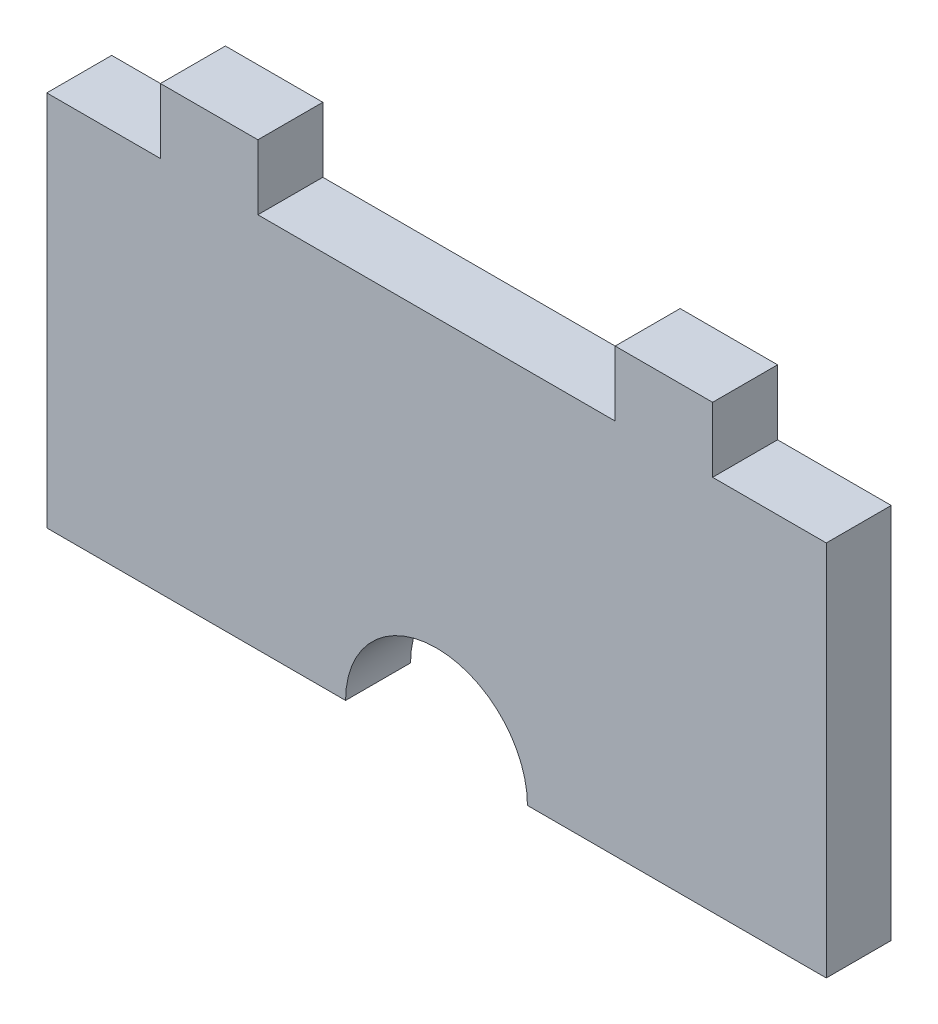
ISO-10303-21;
HEADER;
FILE_DESCRIPTION(('STEP AP214'),'2;1');
FILE_NAME('part.step','',(''),(''),'','','');
FILE_SCHEMA(('AUTOMOTIVE_DESIGN { 1 0 10303 214 1 1 1 1 }'));
ENDSEC;
DATA;
#1=APPLICATION_CONTEXT('core data for automotive mechanical design processes');
#2=APPLICATION_PROTOCOL_DEFINITION('international standard','automotive_design',2000,#1);
#3=PRODUCT_CONTEXT('',#1,'mechanical');
#4=PRODUCT('Part','Part','',(#3));
#5=PRODUCT_RELATED_PRODUCT_CATEGORY('part','',(#4));
#6=PRODUCT_DEFINITION_FORMATION('','',#4);
#7=PRODUCT_DEFINITION_CONTEXT('part definition',#1,'design');
#8=PRODUCT_DEFINITION('design','',#6,#7);
#9=PRODUCT_DEFINITION_SHAPE('','',#8);
#10=(LENGTH_UNIT() NAMED_UNIT(*) SI_UNIT(.MILLI.,.METRE.));
#11=(NAMED_UNIT(*) PLANE_ANGLE_UNIT() SI_UNIT($,.RADIAN.));
#12=(NAMED_UNIT(*) SI_UNIT($,.STERADIAN.) SOLID_ANGLE_UNIT());
#13=UNCERTAINTY_MEASURE_WITH_UNIT(LENGTH_MEASURE(1.E-05),#10,'distance_accuracy_value','');
#14=(GEOMETRIC_REPRESENTATION_CONTEXT(3) GLOBAL_UNCERTAINTY_ASSIGNED_CONTEXT((#13)) GLOBAL_UNIT_ASSIGNED_CONTEXT((#10,
#11,#12)) REPRESENTATION_CONTEXT('',''));
#15=CARTESIAN_POINT('',(0.,0.,0.));
#16=DIRECTION('',(0.,0.,1.));
#17=DIRECTION('',(1.,0.,0.));
#18=AXIS2_PLACEMENT_3D('',#15,#16,#17);
#19=CARTESIAN_POINT('',(-76.2,142.24,-12.7));
#20=DIRECTION('',(0.,-1.,0.));
#21=DIRECTION('',(0.,0.,-1.));
#22=AXIS2_PLACEMENT_3D('',#19,#20,#21);
#23=PLANE('',#22);
#24=DIRECTION('',(0.,0.,1.));
#25=VECTOR('',#24,1.);
#26=CARTESIAN_POINT('',(17.78,142.24,-12.7));
#27=LINE('',#26,#25);
#28=CARTESIAN_POINT('',(17.78,142.24,-12.7));
#29=VERTEX_POINT('',#28);
#30=CARTESIAN_POINT('',(17.78,142.24,0.));
#31=VERTEX_POINT('',#30);
#32=EDGE_CURVE('E48',#29,#31,#27,.T.);
#33=ORIENTED_EDGE('',*,*,#32,.F.);
#34=DIRECTION('',(1.,0.,0.));
#35=VECTOR('',#34,1.);
#36=CARTESIAN_POINT('',(-76.2,142.24,-12.7));
#37=LINE('',#36,#35);
#38=CARTESIAN_POINT('',(76.2,142.24,-12.7));
#39=VERTEX_POINT('',#38);
#40=EDGE_CURVE('E391',#29,#39,#37,.T.);
#41=ORIENTED_EDGE('',*,*,#40,.T.);
#42=DIRECTION('',(0.,0.,1.));
#43=VECTOR('',#42,1.);
#44=CARTESIAN_POINT('',(76.2,142.24,-12.7));
#45=LINE('',#44,#43);
#46=CARTESIAN_POINT('',(76.2,142.24,0.));
#47=VERTEX_POINT('',#46);
#48=EDGE_CURVE('E214',#39,#47,#45,.T.);
#49=ORIENTED_EDGE('',*,*,#48,.T.);
#50=DIRECTION('',(1.,0.,0.));
#51=VECTOR('',#50,1.);
#52=CARTESIAN_POINT('',(-76.2,142.24,0.));
#53=LINE('',#52,#51);
#54=EDGE_CURVE('E169',#31,#47,#53,.T.);
#55=ORIENTED_EDGE('',*,*,#54,.F.);
#56=EDGE_LOOP('',(#33,#41,#49,#55));
#57=FACE_BOUND('',#56,.T.);
#58=ADVANCED_FACE('F31',(#57),#23,.T.);
#59=CARTESIAN_POINT('',(-76.2,215.9,-12.7));
#60=DIRECTION('',(-1.,0.,0.));
#61=DIRECTION('',(0.,-1.,0.));
#62=AXIS2_PLACEMENT_3D('',#59,#60,#61);
#63=PLANE('',#62);
#64=DIRECTION('',(0.,-1.,0.));
#65=VECTOR('',#64,1.);
#66=CARTESIAN_POINT('',(-76.2,215.9,0.));
#67=LINE('',#66,#65);
#68=CARTESIAN_POINT('',(-76.2,215.9,0.));
#69=VERTEX_POINT('',#68);
#70=CARTESIAN_POINT('',(-76.2,142.24,0.));
#71=VERTEX_POINT('',#70);
#72=EDGE_CURVE('E166',#69,#71,#67,.T.);
#73=ORIENTED_EDGE('',*,*,#72,.F.);
#74=DIRECTION('',(0.,0.,1.));
#75=VECTOR('',#74,1.);
#76=CARTESIAN_POINT('',(-76.2,215.9,-12.7));
#77=LINE('',#76,#75);
#78=CARTESIAN_POINT('',(-76.2,215.9,-12.7));
#79=VERTEX_POINT('',#78);
#80=EDGE_CURVE('E11',#79,#69,#77,.T.);
#81=ORIENTED_EDGE('',*,*,#80,.F.);
#82=DIRECTION('',(0.,-1.,0.));
#83=VECTOR('',#82,1.);
#84=CARTESIAN_POINT('',(-76.2,215.9,-12.7));
#85=LINE('',#84,#83);
#86=CARTESIAN_POINT('',(-76.2,142.24,-12.7));
#87=VERTEX_POINT('',#86);
#88=EDGE_CURVE('E199',#79,#87,#85,.T.);
#89=ORIENTED_EDGE('',*,*,#88,.T.);
#90=DIRECTION('',(0.,0.,1.));
#91=VECTOR('',#90,1.);
#92=CARTESIAN_POINT('',(-76.2,142.24,-12.7));
#93=LINE('',#92,#91);
#94=EDGE_CURVE('E35',#87,#71,#93,.T.);
#95=ORIENTED_EDGE('',*,*,#94,.T.);
#96=EDGE_LOOP('',(#73,#81,#89,#95));
#97=FACE_BOUND('',#96,.T.);
#98=ADVANCED_FACE('F33',(#97),#63,.T.);
#99=CARTESIAN_POINT('',(-76.2,215.9,-12.7));
#100=DIRECTION('',(0.,1.,0.));
#101=DIRECTION('',(0.,0.,1.));
#102=AXIS2_PLACEMENT_3D('',#99,#100,#101);
#103=PLANE('',#102);
#104=DIRECTION('',(-1.,0.,0.));
#105=VECTOR('',#104,1.);
#106=CARTESIAN_POINT('',(-76.2,215.9,0.));
#107=LINE('',#106,#105);
#108=CARTESIAN_POINT('',(-53.975,215.9,0.));
#109=VERTEX_POINT('',#108);
#110=EDGE_CURVE('E197',#109,#69,#107,.T.);
#111=ORIENTED_EDGE('',*,*,#110,.F.);
#112=DIRECTION('',(0.,0.,1.));
#113=VECTOR('',#112,1.);
#114=CARTESIAN_POINT('',(-53.975,215.9,-12.7));
#115=LINE('',#114,#113);
#116=CARTESIAN_POINT('',(-53.975,215.9,-12.7));
#117=VERTEX_POINT('',#116);
#118=EDGE_CURVE('E40',#117,#109,#115,.T.);
#119=ORIENTED_EDGE('',*,*,#118,.F.);
#120=DIRECTION('',(-1.,0.,0.));
#121=VECTOR('',#120,1.);
#122=CARTESIAN_POINT('',(-76.2,215.9,-12.7));
#123=LINE('',#122,#121);
#124=EDGE_CURVE('E156',#117,#79,#123,.T.);
#125=ORIENTED_EDGE('',*,*,#124,.T.);
#126=ORIENTED_EDGE('',*,*,#80,.T.);
#127=EDGE_LOOP('',(#111,#119,#125,#126));
#128=FACE_BOUND('',#127,.T.);
#129=ADVANCED_FACE('F226',(#128),#103,.T.);
#130=CARTESIAN_POINT('',(-53.975,215.9,-12.7));
#131=DIRECTION('',(-1.,0.,0.));
#132=DIRECTION('',(0.,0.,1.));
#133=AXIS2_PLACEMENT_3D('',#130,#131,#132);
#134=PLANE('',#133);
#135=DIRECTION('',(0.,-1.,0.));
#136=VECTOR('',#135,1.);
#137=CARTESIAN_POINT('',(-53.975,215.9,0.));
#138=LINE('',#137,#136);
#139=CARTESIAN_POINT('',(-53.975,228.6,0.));
#140=VERTEX_POINT('',#139);
#141=EDGE_CURVE('E142',#140,#109,#138,.T.);
#142=ORIENTED_EDGE('',*,*,#141,.F.);
#143=DIRECTION('',(0.,0.,1.));
#144=VECTOR('',#143,1.);
#145=CARTESIAN_POINT('',(-53.975,228.6,-12.7));
#146=LINE('',#145,#144);
#147=CARTESIAN_POINT('',(-53.975,228.6,-12.7));
#148=VERTEX_POINT('',#147);
#149=EDGE_CURVE('E136',#148,#140,#146,.T.);
#150=ORIENTED_EDGE('',*,*,#149,.F.);
#151=DIRECTION('',(0.,-1.,0.));
#152=VECTOR('',#151,1.);
#153=CARTESIAN_POINT('',(-53.975,215.9,-12.7));
#154=LINE('',#153,#152);
#155=EDGE_CURVE('E139',#148,#117,#154,.T.);
#156=ORIENTED_EDGE('',*,*,#155,.T.);
#157=ORIENTED_EDGE('',*,*,#118,.T.);
#158=EDGE_LOOP('',(#142,#150,#156,#157));
#159=FACE_BOUND('',#158,.T.);
#160=ADVANCED_FACE('F138',(#159),#134,.T.);
#161=CARTESIAN_POINT('',(-34.925,228.6,-12.7));
#162=DIRECTION('',(0.,1.,0.));
#163=DIRECTION('',(0.,0.,1.));
#164=AXIS2_PLACEMENT_3D('',#161,#162,#163);
#165=PLANE('',#164);
#166=DIRECTION('',(-1.,0.,0.));
#167=VECTOR('',#166,1.);
#168=CARTESIAN_POINT('',(-34.925,228.6,0.));
#169=LINE('',#168,#167);
#170=CARTESIAN_POINT('',(-34.925,228.6,0.));
#171=VERTEX_POINT('',#170);
#172=EDGE_CURVE('E194',#171,#140,#169,.T.);
#173=ORIENTED_EDGE('',*,*,#172,.F.);
#174=DIRECTION('',(0.,0.,1.));
#175=VECTOR('',#174,1.);
#176=CARTESIAN_POINT('',(-34.925,228.6,-12.7));
#177=LINE('',#176,#175);
#178=CARTESIAN_POINT('',(-34.925,228.6,-12.7));
#179=VERTEX_POINT('',#178);
#180=EDGE_CURVE('E147',#179,#171,#177,.T.);
#181=ORIENTED_EDGE('',*,*,#180,.F.);
#182=DIRECTION('',(-1.,0.,0.));
#183=VECTOR('',#182,1.);
#184=CARTESIAN_POINT('',(-34.925,228.6,-12.7));
#185=LINE('',#184,#183);
#186=EDGE_CURVE('E154',#179,#148,#185,.T.);
#187=ORIENTED_EDGE('',*,*,#186,.T.);
#188=ORIENTED_EDGE('',*,*,#149,.T.);
#189=EDGE_LOOP('',(#173,#181,#187,#188));
#190=FACE_BOUND('',#189,.T.);
#191=ADVANCED_FACE('F158',(#190),#165,.T.);
#192=CARTESIAN_POINT('',(-34.925,215.9,-12.7));
#193=DIRECTION('',(1.,0.,0.));
#194=DIRECTION('',(0.,0.,-1.));
#195=AXIS2_PLACEMENT_3D('',#192,#193,#194);
#196=PLANE('',#195);
#197=DIRECTION('',(0.,1.,0.));
#198=VECTOR('',#197,1.);
#199=CARTESIAN_POINT('',(-34.925,215.9,0.));
#200=LINE('',#199,#198);
#201=CARTESIAN_POINT('',(-34.925,215.9,0.));
#202=VERTEX_POINT('',#201);
#203=EDGE_CURVE('E191',#202,#171,#200,.T.);
#204=ORIENTED_EDGE('',*,*,#203,.F.);
#205=DIRECTION('',(0.,0.,1.));
#206=VECTOR('',#205,1.);
#207=CARTESIAN_POINT('',(-34.925,215.9,-12.7));
#208=LINE('',#207,#206);
#209=CARTESIAN_POINT('',(-34.925,215.9,-12.7));
#210=VERTEX_POINT('',#209);
#211=EDGE_CURVE('E203',#210,#202,#208,.T.);
#212=ORIENTED_EDGE('',*,*,#211,.F.);
#213=DIRECTION('',(0.,1.,0.));
#214=VECTOR('',#213,1.);
#215=CARTESIAN_POINT('',(-34.925,215.9,-12.7));
#216=LINE('',#215,#214);
#217=EDGE_CURVE('E159',#210,#179,#216,.T.);
#218=ORIENTED_EDGE('',*,*,#217,.T.);
#219=ORIENTED_EDGE('',*,*,#180,.T.);
#220=EDGE_LOOP('',(#204,#212,#218,#219));
#221=FACE_BOUND('',#220,.T.);
#222=ADVANCED_FACE('F269',(#221),#196,.T.);
#223=CARTESIAN_POINT('',(-34.925,215.9,-12.7));
#224=DIRECTION('',(0.,1.,0.));
#225=DIRECTION('',(0.,0.,1.));
#226=AXIS2_PLACEMENT_3D('',#223,#224,#225);
#227=PLANE('',#226);
#228=DIRECTION('',(-1.,0.,0.));
#229=VECTOR('',#228,1.);
#230=CARTESIAN_POINT('',(-34.925,215.9,0.));
#231=LINE('',#230,#229);
#232=CARTESIAN_POINT('',(34.925,215.9,0.));
#233=VERTEX_POINT('',#232);
#234=EDGE_CURVE('E188',#233,#202,#231,.T.);
#235=ORIENTED_EDGE('',*,*,#234,.F.);
#236=DIRECTION('',(0.,0.,1.));
#237=VECTOR('',#236,1.);
#238=CARTESIAN_POINT('',(34.925,215.9,-12.7));
#239=LINE('',#238,#237);
#240=CARTESIAN_POINT('',(34.925,215.9,-12.7));
#241=VERTEX_POINT('',#240);
#242=EDGE_CURVE('E205',#241,#233,#239,.T.);
#243=ORIENTED_EDGE('',*,*,#242,.F.);
#244=DIRECTION('',(-1.,0.,0.));
#245=VECTOR('',#244,1.);
#246=CARTESIAN_POINT('',(-34.925,215.9,-12.7));
#247=LINE('',#246,#245);
#248=EDGE_CURVE('E161',#241,#210,#247,.T.);
#249=ORIENTED_EDGE('',*,*,#248,.T.);
#250=ORIENTED_EDGE('',*,*,#211,.T.);
#251=EDGE_LOOP('',(#235,#243,#249,#250));
#252=FACE_BOUND('',#251,.T.);
#253=ADVANCED_FACE('F265',(#252),#227,.T.);
#254=CARTESIAN_POINT('',(34.925,215.9,-12.7));
#255=DIRECTION('',(-1.,0.,0.));
#256=DIRECTION('',(0.,0.,1.));
#257=AXIS2_PLACEMENT_3D('',#254,#255,#256);
#258=PLANE('',#257);
#259=DIRECTION('',(0.,-1.,0.));
#260=VECTOR('',#259,1.);
#261=CARTESIAN_POINT('',(34.925,215.9,0.));
#262=LINE('',#261,#260);
#263=CARTESIAN_POINT('',(34.925,228.6,0.));
#264=VERTEX_POINT('',#263);
#265=EDGE_CURVE('E185',#264,#233,#262,.T.);
#266=ORIENTED_EDGE('',*,*,#265,.F.);
#267=DIRECTION('',(0.,0.,1.));
#268=VECTOR('',#267,1.);
#269=CARTESIAN_POINT('',(34.925,228.6,-12.7));
#270=LINE('',#269,#268);
#271=CARTESIAN_POINT('',(34.925,228.6,-12.7));
#272=VERTEX_POINT('',#271);
#273=EDGE_CURVE('E207',#272,#264,#270,.T.);
#274=ORIENTED_EDGE('',*,*,#273,.F.);
#275=DIRECTION('',(0.,-1.,0.));
#276=VECTOR('',#275,1.);
#277=CARTESIAN_POINT('',(34.925,215.9,-12.7));
#278=LINE('',#277,#276);
#279=EDGE_CURVE('E374',#272,#241,#278,.T.);
#280=ORIENTED_EDGE('',*,*,#279,.T.);
#281=ORIENTED_EDGE('',*,*,#242,.T.);
#282=EDGE_LOOP('',(#266,#274,#280,#281));
#283=FACE_BOUND('',#282,.T.);
#284=ADVANCED_FACE('F261',(#283),#258,.T.);
#285=CARTESIAN_POINT('',(53.975,228.6,-12.7));
#286=DIRECTION('',(0.,1.,0.));
#287=DIRECTION('',(0.,0.,1.));
#288=AXIS2_PLACEMENT_3D('',#285,#286,#287);
#289=PLANE('',#288);
#290=DIRECTION('',(-1.,0.,0.));
#291=VECTOR('',#290,1.);
#292=CARTESIAN_POINT('',(53.975,228.6,0.));
#293=LINE('',#292,#291);
#294=CARTESIAN_POINT('',(53.975,228.6,0.));
#295=VERTEX_POINT('',#294);
#296=EDGE_CURVE('E182',#295,#264,#293,.T.);
#297=ORIENTED_EDGE('',*,*,#296,.F.);
#298=DIRECTION('',(0.,0.,1.));
#299=VECTOR('',#298,1.);
#300=CARTESIAN_POINT('',(53.975,228.6,-12.7));
#301=LINE('',#300,#299);
#302=CARTESIAN_POINT('',(53.975,228.6,-12.7));
#303=VERTEX_POINT('',#302);
#304=EDGE_CURVE('E209',#303,#295,#301,.T.);
#305=ORIENTED_EDGE('',*,*,#304,.F.);
#306=DIRECTION('',(-1.,0.,0.));
#307=VECTOR('',#306,1.);
#308=CARTESIAN_POINT('',(53.975,228.6,-12.7));
#309=LINE('',#308,#307);
#310=EDGE_CURVE('E375',#303,#272,#309,.T.);
#311=ORIENTED_EDGE('',*,*,#310,.T.);
#312=ORIENTED_EDGE('',*,*,#273,.T.);
#313=EDGE_LOOP('',(#297,#305,#311,#312));
#314=FACE_BOUND('',#313,.T.);
#315=ADVANCED_FACE('F257',(#314),#289,.T.);
#316=CARTESIAN_POINT('',(53.975,215.9,-12.7));
#317=DIRECTION('',(1.,0.,0.));
#318=DIRECTION('',(0.,0.,-1.));
#319=AXIS2_PLACEMENT_3D('',#316,#317,#318);
#320=PLANE('',#319);
#321=DIRECTION('',(0.,1.,0.));
#322=VECTOR('',#321,1.);
#323=CARTESIAN_POINT('',(53.975,215.9,0.));
#324=LINE('',#323,#322);
#325=CARTESIAN_POINT('',(53.975,215.9,0.));
#326=VERTEX_POINT('',#325);
#327=EDGE_CURVE('E179',#326,#295,#324,.T.);
#328=ORIENTED_EDGE('',*,*,#327,.F.);
#329=DIRECTION('',(0.,0.,1.));
#330=VECTOR('',#329,1.);
#331=CARTESIAN_POINT('',(53.975,215.9,-12.7));
#332=LINE('',#331,#330);
#333=CARTESIAN_POINT('',(53.975,215.9,-12.7));
#334=VERTEX_POINT('',#333);
#335=EDGE_CURVE('E211',#334,#326,#332,.T.);
#336=ORIENTED_EDGE('',*,*,#335,.F.);
#337=DIRECTION('',(0.,1.,0.));
#338=VECTOR('',#337,1.);
#339=CARTESIAN_POINT('',(53.975,215.9,-12.7));
#340=LINE('',#339,#338);
#341=EDGE_CURVE('E380',#334,#303,#340,.T.);
#342=ORIENTED_EDGE('',*,*,#341,.T.);
#343=ORIENTED_EDGE('',*,*,#304,.T.);
#344=EDGE_LOOP('',(#328,#336,#342,#343));
#345=FACE_BOUND('',#344,.T.);
#346=ADVANCED_FACE('F251',(#345),#320,.T.);
#347=CARTESIAN_POINT('',(53.975,215.9,-12.7));
#348=DIRECTION('',(0.,1.,0.));
#349=DIRECTION('',(0.,0.,1.));
#350=AXIS2_PLACEMENT_3D('',#347,#348,#349);
#351=PLANE('',#350);
#352=DIRECTION('',(-1.,0.,0.));
#353=VECTOR('',#352,1.);
#354=CARTESIAN_POINT('',(53.975,215.9,0.));
#355=LINE('',#354,#353);
#356=CARTESIAN_POINT('',(76.2,215.9,0.));
#357=VERTEX_POINT('',#356);
#358=EDGE_CURVE('E176',#357,#326,#355,.T.);
#359=ORIENTED_EDGE('',*,*,#358,.F.);
#360=DIRECTION('',(0.,0.,1.));
#361=VECTOR('',#360,1.);
#362=CARTESIAN_POINT('',(76.2,215.9,-12.7));
#363=LINE('',#362,#361);
#364=CARTESIAN_POINT('',(76.2,215.9,-12.7));
#365=VERTEX_POINT('',#364);
#366=EDGE_CURVE('E213',#365,#357,#363,.T.);
#367=ORIENTED_EDGE('',*,*,#366,.F.);
#368=DIRECTION('',(-1.,0.,0.));
#369=VECTOR('',#368,1.);
#370=CARTESIAN_POINT('',(53.975,215.9,-12.7));
#371=LINE('',#370,#369);
#372=EDGE_CURVE('E383',#365,#334,#371,.T.);
#373=ORIENTED_EDGE('',*,*,#372,.T.);
#374=ORIENTED_EDGE('',*,*,#335,.T.);
#375=EDGE_LOOP('',(#359,#367,#373,#374));
#376=FACE_BOUND('',#375,.T.);
#377=ADVANCED_FACE('F246',(#376),#351,.T.);
#378=CARTESIAN_POINT('',(76.2,215.9,-12.7));
#379=DIRECTION('',(1.,0.,0.));
#380=DIRECTION('',(0.,0.,-1.));
#381=AXIS2_PLACEMENT_3D('',#378,#379,#380);
#382=PLANE('',#381);
#383=DIRECTION('',(0.,1.,0.));
#384=VECTOR('',#383,1.);
#385=CARTESIAN_POINT('',(76.2,215.9,0.));
#386=LINE('',#385,#384);
#387=EDGE_CURVE('E173',#47,#357,#386,.T.);
#388=ORIENTED_EDGE('',*,*,#387,.F.);
#389=ORIENTED_EDGE('',*,*,#48,.F.);
#390=DIRECTION('',(0.,1.,0.));
#391=VECTOR('',#390,1.);
#392=CARTESIAN_POINT('',(76.2,215.9,-12.7));
#393=LINE('',#392,#391);
#394=EDGE_CURVE('E386',#39,#365,#393,.T.);
#395=ORIENTED_EDGE('',*,*,#394,.T.);
#396=ORIENTED_EDGE('',*,*,#366,.T.);
#397=EDGE_LOOP('',(#388,#389,#395,#396));
#398=FACE_BOUND('',#397,.T.);
#399=ADVANCED_FACE('F240',(#398),#382,.T.);
#400=DIRECTION('',(0.,0.,1.));
#401=VECTOR('',#400,1.);
#402=CARTESIAN_POINT('',(-17.78,142.24,-12.7));
#403=LINE('',#402,#401);
#404=CARTESIAN_POINT('',(-17.78,142.24,0.));
#405=VERTEX_POINT('',#404);
#406=CARTESIAN_POINT('',(-17.78,142.24,-12.7));
#407=VERTEX_POINT('',#406);
#408=EDGE_CURVE('E223',#405,#407,#403,.F.);
#409=ORIENTED_EDGE('',*,*,#408,.F.);
#410=EDGE_CURVE('E170',#71,#405,#53,.T.);
#411=ORIENTED_EDGE('',*,*,#410,.F.);
#412=ORIENTED_EDGE('',*,*,#94,.F.);
#413=EDGE_CURVE('E389',#87,#407,#37,.T.);
#414=ORIENTED_EDGE('',*,*,#413,.T.);
#415=EDGE_LOOP('',(#409,#411,#412,#414));
#416=FACE_BOUND('',#415,.T.);
#417=ADVANCED_FACE('F221',(#416),#23,.T.);
#418=CARTESIAN_POINT('',(-76.2,142.24,-12.7));
#419=DIRECTION('',(0.,0.,1.));
#420=DIRECTION('',(1.,0.,0.));
#421=AXIS2_PLACEMENT_3D('',#418,#419,#420);
#422=PLANE('',#421);
#423=ORIENTED_EDGE('',*,*,#40,.F.);
#424=CARTESIAN_POINT('',(0.,142.24,-12.7));
#425=DIRECTION('',(0.,0.,1.));
#426=DIRECTION('',(1.,0.,0.));
#427=AXIS2_PLACEMENT_3D('',#424,#425,#426);
#428=CIRCLE('',#427,17.78);
#429=EDGE_CURVE('E395',#29,#407,#428,.T.);
#430=ORIENTED_EDGE('',*,*,#429,.T.);
#431=ORIENTED_EDGE('',*,*,#413,.F.);
#432=ORIENTED_EDGE('',*,*,#88,.F.);
#433=ORIENTED_EDGE('',*,*,#124,.F.);
#434=ORIENTED_EDGE('',*,*,#155,.F.);
#435=ORIENTED_EDGE('',*,*,#186,.F.);
#436=ORIENTED_EDGE('',*,*,#217,.F.);
#437=ORIENTED_EDGE('',*,*,#248,.F.);
#438=ORIENTED_EDGE('',*,*,#279,.F.);
#439=ORIENTED_EDGE('',*,*,#310,.F.);
#440=ORIENTED_EDGE('',*,*,#341,.F.);
#441=ORIENTED_EDGE('',*,*,#372,.F.);
#442=ORIENTED_EDGE('',*,*,#394,.F.);
#443=EDGE_LOOP('',(#423,#430,#431,#432,#433,#434,#435,#436,#437,#438,#439,#440,#441,#442));
#444=FACE_BOUND('',#443,.T.);
#445=ADVANCED_FACE('F152',(#444),#422,.F.);
#446=CARTESIAN_POINT('',(-76.2,142.24,0.));
#447=DIRECTION('',(0.,0.,1.));
#448=DIRECTION('',(1.,0.,0.));
#449=AXIS2_PLACEMENT_3D('',#446,#447,#448);
#450=PLANE('',#449);
#451=CARTESIAN_POINT('',(0.,142.24,0.));
#452=DIRECTION('',(0.,0.,1.));
#453=DIRECTION('',(1.,0.,0.));
#454=AXIS2_PLACEMENT_3D('',#451,#452,#453);
#455=CIRCLE('',#454,17.78);
#456=EDGE_CURVE('E396',#31,#405,#455,.T.);
#457=ORIENTED_EDGE('',*,*,#456,.F.);
#458=ORIENTED_EDGE('',*,*,#54,.T.);
#459=ORIENTED_EDGE('',*,*,#387,.T.);
#460=ORIENTED_EDGE('',*,*,#358,.T.);
#461=ORIENTED_EDGE('',*,*,#327,.T.);
#462=ORIENTED_EDGE('',*,*,#296,.T.);
#463=ORIENTED_EDGE('',*,*,#265,.T.);
#464=ORIENTED_EDGE('',*,*,#234,.T.);
#465=ORIENTED_EDGE('',*,*,#203,.T.);
#466=ORIENTED_EDGE('',*,*,#172,.T.);
#467=ORIENTED_EDGE('',*,*,#141,.T.);
#468=ORIENTED_EDGE('',*,*,#110,.T.);
#469=ORIENTED_EDGE('',*,*,#72,.T.);
#470=ORIENTED_EDGE('',*,*,#410,.T.);
#471=EDGE_LOOP('',(#457,#458,#459,#460,#461,#462,#463,#464,#465,#466,#467,#468,#469,#470));
#472=FACE_BOUND('',#471,.T.);
#473=ADVANCED_FACE('F225',(#472),#450,.T.);
#474=CARTESIAN_POINT('',(0.,142.24,-12.7));
#475=DIRECTION('',(0.,0.,1.));
#476=DIRECTION('',(1.,0.,0.));
#477=AXIS2_PLACEMENT_3D('',#474,#475,#476);
#478=CYLINDRICAL_SURFACE('',#477,17.78);
#479=ORIENTED_EDGE('',*,*,#32,.T.);
#480=ORIENTED_EDGE('',*,*,#456,.T.);
#481=ORIENTED_EDGE('',*,*,#408,.T.);
#482=ORIENTED_EDGE('',*,*,#429,.F.);
#483=EDGE_LOOP('',(#479,#480,#481,#482));
#484=FACE_BOUND('',#483,.T.);
#485=ADVANCED_FACE('F331',(#484),#478,.F.);
#486=CLOSED_SHELL('',(#58,#98,#129,#160,#191,#222,#253,#284,#315,#346,#377,#399,#417,#445,#473,#485));
#487=MANIFOLD_SOLID_BREP('B2',#486);
#488=ADVANCED_BREP_SHAPE_REPRESENTATION('',(#18,#487),#14);
#489=SHAPE_DEFINITION_REPRESENTATION(#9,#488);
ENDSEC;
END-ISO-10303-21;
